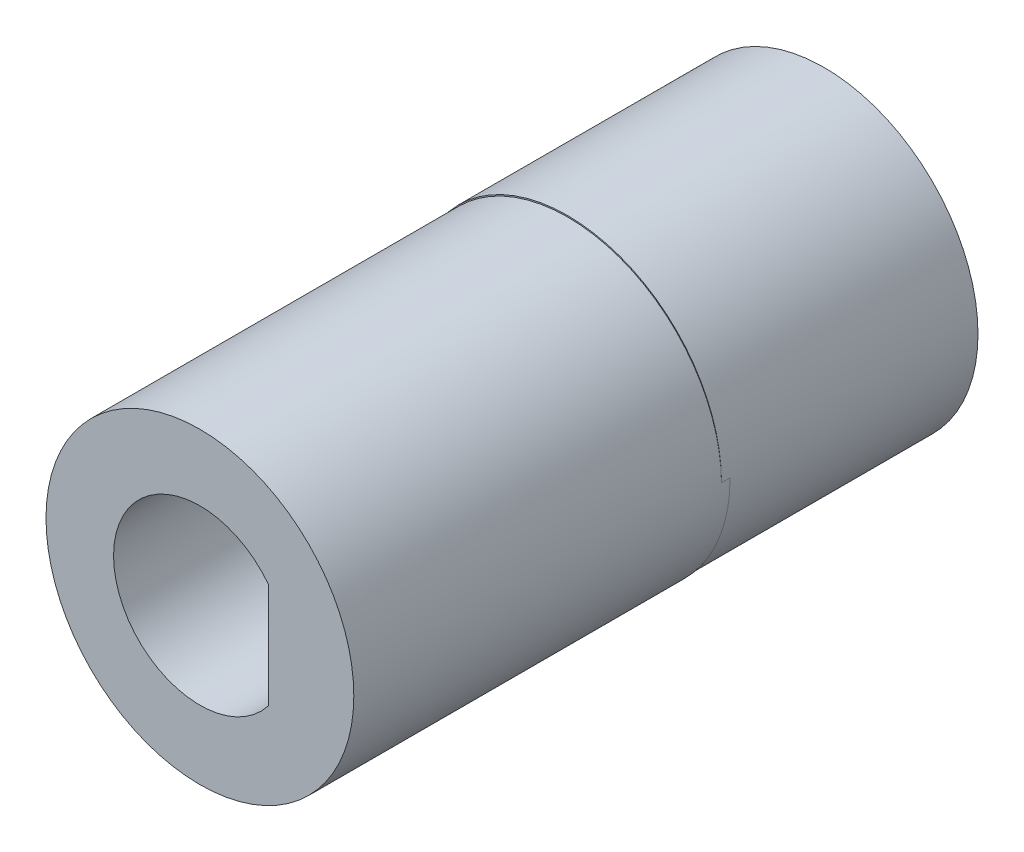
ISO-10303-21;
HEADER;
FILE_DESCRIPTION(('STEP AP214'),'2;1');
FILE_NAME('part.step','',(''),(''),'','','');
FILE_SCHEMA(('AUTOMOTIVE_DESIGN { 1 0 10303 214 1 1 1 1 }'));
ENDSEC;
DATA;
#1=APPLICATION_CONTEXT('core data for automotive mechanical design processes');
#2=APPLICATION_PROTOCOL_DEFINITION('international standard','automotive_design',2000,#1);
#3=PRODUCT_CONTEXT('',#1,'mechanical');
#4=PRODUCT('Part','Part','',(#3));
#5=PRODUCT_RELATED_PRODUCT_CATEGORY('part','',(#4));
#6=PRODUCT_DEFINITION_FORMATION('','',#4);
#7=PRODUCT_DEFINITION_CONTEXT('part definition',#1,'design');
#8=PRODUCT_DEFINITION('design','',#6,#7);
#9=PRODUCT_DEFINITION_SHAPE('','',#8);
#10=(LENGTH_UNIT() NAMED_UNIT(*) SI_UNIT(.MILLI.,.METRE.));
#11=(NAMED_UNIT(*) PLANE_ANGLE_UNIT() SI_UNIT($,.RADIAN.));
#12=(NAMED_UNIT(*) SI_UNIT($,.STERADIAN.) SOLID_ANGLE_UNIT());
#13=UNCERTAINTY_MEASURE_WITH_UNIT(LENGTH_MEASURE(1.E-05),#10,'distance_accuracy_value','');
#14=(GEOMETRIC_REPRESENTATION_CONTEXT(3) GLOBAL_UNCERTAINTY_ASSIGNED_CONTEXT((#13)) GLOBAL_UNIT_ASSIGNED_CONTEXT((#10,
#11,#12)) REPRESENTATION_CONTEXT('',''));
#15=CARTESIAN_POINT('',(0.,0.,0.));
#16=DIRECTION('',(0.,0.,1.));
#17=DIRECTION('',(1.,0.,0.));
#18=AXIS2_PLACEMENT_3D('',#15,#16,#17);
#19=CARTESIAN_POINT('',(0.,0.,-8.));
#20=DIRECTION('',(0.,0.,1.));
#21=DIRECTION('',(1.,0.,0.));
#22=AXIS2_PLACEMENT_3D('',#19,#20,#21);
#23=CYLINDRICAL_SURFACE('',#22,9.);
#24=CARTESIAN_POINT('',(0.,0.,-8.));
#25=DIRECTION('',(0.,0.,1.));
#26=DIRECTION('',(1.,0.,0.));
#27=AXIS2_PLACEMENT_3D('',#24,#25,#26);
#28=CIRCLE('',#27,9.);
#29=CARTESIAN_POINT('',(9.,0.,-8.));
#30=VERTEX_POINT('',#29);
#31=EDGE_CURVE('E235',#30,#30,#28,.T.);
#32=ORIENTED_EDGE('',*,*,#31,.T.);
#33=EDGE_LOOP('',(#32));
#34=FACE_BOUND('',#33,.T.);
#35=CARTESIAN_POINT('',(0.,0.,7.));
#36=DIRECTION('',(0.,0.,1.));
#37=DIRECTION('',(1.,0.,0.));
#38=AXIS2_PLACEMENT_3D('',#35,#36,#37);
#39=CIRCLE('',#38,9.);
#40=CARTESIAN_POINT('',(8.99992217133125,-0.0374287320141755,7.));
#41=VERTEX_POINT('',#40);
#42=CARTESIAN_POINT('',(-8.99992217133125,-0.0374287320141784,7.));
#43=VERTEX_POINT('',#42);
#44=EDGE_CURVE('E226',#41,#43,#39,.T.);
#45=ORIENTED_EDGE('',*,*,#44,.F.);
#46=DIRECTION('',(0.,0.,1.));
#47=VECTOR('',#46,1.);
#48=CARTESIAN_POINT('',(8.99992217133125,-0.0374287320141764,11.5000000000001));
#49=LINE('',#48,#47);
#50=CARTESIAN_POINT('',(8.99992217133125,-0.0374287320141754,6.50000000000007));
#51=VERTEX_POINT('',#50);
#52=EDGE_CURVE('E83',#41,#51,#49,.F.);
#53=ORIENTED_EDGE('',*,*,#52,.T.);
#54=CARTESIAN_POINT('',(0.,0.,6.50000000000007));
#55=DIRECTION('',(0.,0.,-1.));
#56=DIRECTION('',(0.,1.,0.));
#57=AXIS2_PLACEMENT_3D('',#54,#55,#56);
#58=CIRCLE('',#57,9.);
#59=CARTESIAN_POINT('',(-8.99992217133125,-0.0374287320141784,6.50000000000007));
#60=VERTEX_POINT('',#59);
#61=EDGE_CURVE('E12',#60,#51,#58,.F.);
#62=ORIENTED_EDGE('',*,*,#61,.F.);
#63=DIRECTION('',(0.,0.,1.));
#64=VECTOR('',#63,1.);
#65=CARTESIAN_POINT('',(-8.99992217133125,-0.037428732014178,11.5000000000001));
#66=LINE('',#65,#64);
#67=EDGE_CURVE('E199',#60,#43,#66,.T.);
#68=ORIENTED_EDGE('',*,*,#67,.T.);
#69=EDGE_LOOP('',(#45,#53,#62,#68));
#70=FACE_BOUND('',#69,.T.);
#71=ADVANCED_FACE('F60',(#34,#70),#23,.T.);
#72=CARTESIAN_POINT('',(0.,0.,7.));
#73=DIRECTION('',(0.,0.,1.));
#74=DIRECTION('',(1.,0.,0.));
#75=AXIS2_PLACEMENT_3D('',#72,#73,#74);
#76=PLANE('',#75);
#77=DIRECTION('',(0.,-1.00000000000001,0.));
#78=VECTOR('',#77,1.);
#79=CARTESIAN_POINT('',(2.49999999999306,0.,7.));
#80=LINE('',#79,#78);
#81=CARTESIAN_POINT('',(2.49999999999682,1.74714052097017,7.));
#82=VERTEX_POINT('',#81);
#83=CARTESIAN_POINT('',(2.49999999999773,-1.74714052095881,7.));
#84=VERTEX_POINT('',#83);
#85=EDGE_CURVE('E208',#82,#84,#80,.T.);
#86=ORIENTED_EDGE('',*,*,#85,.T.);
#87=CARTESIAN_POINT('',(0.,0.,7.));
#88=DIRECTION('',(0.,0.,1.));
#89=DIRECTION('',(1.00000000000001,0.,0.));
#90=AXIS2_PLACEMENT_3D('',#87,#88,#89);
#91=CIRCLE('',#90,3.05);
#92=EDGE_CURVE('E212',#82,#84,#91,.T.);
#93=ORIENTED_EDGE('',*,*,#92,.F.);
#94=EDGE_LOOP('',(#86,#93));
#95=FACE_BOUND('',#94,.T.);
#96=CARTESIAN_POINT('',(1.90958480825063E-11,6.67297166736234E-13,7.));
#97=DIRECTION('',(0.,0.,1.));
#98=DIRECTION('',(1.,0.,0.));
#99=AXIS2_PLACEMENT_3D('',#96,#97,#98);
#100=CIRCLE('',#99,5.05);
#101=CARTESIAN_POINT('',(5.0500000000191,6.67297166736234E-13,7.));
#102=VERTEX_POINT('',#101);
#103=EDGE_CURVE('E68',#102,#102,#100,.F.);
#104=ORIENTED_EDGE('',*,*,#103,.F.);
#105=EDGE_LOOP('',(#104));
#106=FACE_BOUND('',#105,.T.);
#107=ADVANCED_FACE('F249',(#95,#106),#76,.T.);
#108=CARTESIAN_POINT('',(0.,0.,-8.));
#109=DIRECTION('',(0.,0.,1.));
#110=DIRECTION('',(1.,0.,0.));
#111=AXIS2_PLACEMENT_3D('',#108,#109,#110);
#112=PLANE('',#111);
#113=CARTESIAN_POINT('',(0.,0.,-8.));
#114=DIRECTION('',(0.,0.,1.));
#115=DIRECTION('',(1.,0.,0.));
#116=AXIS2_PLACEMENT_3D('',#113,#114,#115);
#117=CIRCLE('',#116,3.05);
#118=CARTESIAN_POINT('',(3.05,0.,-8.));
#119=VERTEX_POINT('',#118);
#120=EDGE_CURVE('E231',#119,#119,#117,.T.);
#121=ORIENTED_EDGE('',*,*,#120,.T.);
#122=EDGE_LOOP('',(#121));
#123=FACE_BOUND('',#122,.T.);
#124=ORIENTED_EDGE('',*,*,#31,.F.);
#125=EDGE_LOOP('',(#124));
#126=FACE_BOUND('',#125,.T.);
#127=ADVANCED_FACE('F251',(#123,#126),#112,.F.);
#128=CARTESIAN_POINT('',(0.,0.,-8.));
#129=DIRECTION('',(0.,0.,1.));
#130=DIRECTION('',(1.,0.,0.));
#131=AXIS2_PLACEMENT_3D('',#128,#129,#130);
#132=CYLINDRICAL_SURFACE('',#131,3.05);
#133=ORIENTED_EDGE('',*,*,#120,.F.);
#134=EDGE_LOOP('',(#133));
#135=FACE_BOUND('',#134,.T.);
#136=CARTESIAN_POINT('',(0.,0.,0.));
#137=DIRECTION('',(0.,0.,1.));
#138=DIRECTION('',(1.,0.,0.));
#139=AXIS2_PLACEMENT_3D('',#136,#137,#138);
#140=CIRCLE('',#139,3.05);
#141=CARTESIAN_POINT('',(2.50000000000245,-1.74714052096211,0.));
#142=VERTEX_POINT('',#141);
#143=CARTESIAN_POINT('',(2.4999999999931,1.74714052097553,0.));
#144=VERTEX_POINT('',#143);
#145=EDGE_CURVE('E230',#142,#144,#140,.T.);
#146=ORIENTED_EDGE('',*,*,#145,.T.);
#147=DIRECTION('',(0.,0.,-1.));
#148=VECTOR('',#147,1.);
#149=CARTESIAN_POINT('',(2.49999999999995,1.74714052097236,7.));
#150=LINE('',#149,#148);
#151=EDGE_CURVE('E222',#82,#144,#150,.T.);
#152=ORIENTED_EDGE('',*,*,#151,.F.);
#153=ORIENTED_EDGE('',*,*,#92,.T.);
#154=DIRECTION('',(0.,0.,-1.));
#155=VECTOR('',#154,1.);
#156=CARTESIAN_POINT('',(2.49999999999773,-1.74714052095881,7.));
#157=LINE('',#156,#155);
#158=EDGE_CURVE('E215',#84,#142,#157,.T.);
#159=ORIENTED_EDGE('',*,*,#158,.T.);
#160=EDGE_LOOP('',(#146,#152,#153,#159));
#161=FACE_BOUND('',#160,.T.);
#162=ADVANCED_FACE('F260',(#135,#161),#132,.F.);
#163=ORIENTED_EDGE('',*,*,#44,.T.);
#164=CARTESIAN_POINT('',(0.,-0.0748574640283539,7.));
#165=DIRECTION('',(0.,0.,1.));
#166=DIRECTION('',(1.,0.,0.));
#167=AXIS2_PLACEMENT_3D('',#164,#165,#166);
#168=CIRCLE('',#167,9.);
#169=EDGE_CURVE('E242',#43,#41,#168,.F.);
#170=ORIENTED_EDGE('',*,*,#169,.T.);
#171=EDGE_LOOP('',(#163,#170));
#172=FACE_BOUND('',#171,.T.);
#173=ADVANCED_FACE('F254',(#172),#76,.T.);
#174=CARTESIAN_POINT('',(0.,0.,0.));
#175=DIRECTION('',(0.,0.,1.));
#176=DIRECTION('',(1.,0.,0.));
#177=AXIS2_PLACEMENT_3D('',#174,#175,#176);
#178=PLANE('',#177);
#179=ORIENTED_EDGE('',*,*,#145,.F.);
#180=DIRECTION('',(0.,-1.00000000000001,0.));
#181=VECTOR('',#180,1.);
#182=CARTESIAN_POINT('',(2.49999999999306,0.,0.));
#183=LINE('',#182,#181);
#184=EDGE_CURVE('E207',#144,#142,#183,.T.);
#185=ORIENTED_EDGE('',*,*,#184,.F.);
#186=EDGE_LOOP('',(#179,#185));
#187=FACE_BOUND('',#186,.T.);
#188=ADVANCED_FACE('F265',(#187),#178,.F.);
#189=CARTESIAN_POINT('',(2.49999999999306,0.,7.));
#190=DIRECTION('',(1.,0.,0.));
#191=DIRECTION('',(0.,1.,0.));
#192=AXIS2_PLACEMENT_3D('',#189,#190,#191);
#193=PLANE('',#192);
#194=ORIENTED_EDGE('',*,*,#184,.T.);
#195=ORIENTED_EDGE('',*,*,#158,.F.);
#196=ORIENTED_EDGE('',*,*,#85,.F.);
#197=ORIENTED_EDGE('',*,*,#151,.T.);
#198=EDGE_LOOP('',(#194,#195,#196,#197));
#199=FACE_BOUND('',#198,.T.);
#200=ADVANCED_FACE('F271',(#199),#193,.F.);
#201=CARTESIAN_POINT('',(1.90958487171881E-11,6.67358395786821E-13,6.50000000000007));
#202=DIRECTION('',(0.,0.,1.));
#203=DIRECTION('',(0.,-1.,0.));
#204=AXIS2_PLACEMENT_3D('',#201,#202,#203);
#205=CYLINDRICAL_SURFACE('',#204,5.05);
#206=ORIENTED_EDGE('',*,*,#103,.T.);
#207=EDGE_LOOP('',(#206));
#208=FACE_BOUND('',#207,.T.);
#209=CARTESIAN_POINT('',(1.90958360235527E-11,6.66133814775094E-13,16.5000000000001));
#210=DIRECTION('',(0.,0.,-1.));
#211=DIRECTION('',(0.,1.,0.));
#212=AXIS2_PLACEMENT_3D('',#209,#210,#211);
#213=CIRCLE('',#212,5.05);
#214=CARTESIAN_POINT('',(4.00006136280768,3.08253290231264,16.5000000000001));
#215=VERTEX_POINT('',#214);
#216=CARTESIAN_POINT('',(4.00006136282433,-3.08253290230449,16.5000000000001));
#217=VERTEX_POINT('',#216);
#218=EDGE_CURVE('E75',#215,#217,#213,.T.);
#219=ORIENTED_EDGE('',*,*,#218,.F.);
#220=DIRECTION('',(0.,0.,-1.));
#221=VECTOR('',#220,1.);
#222=CARTESIAN_POINT('',(4.00006136280768,3.08253290231264,28.5000000000001));
#223=LINE('',#222,#221);
#224=CARTESIAN_POINT('',(4.00006136280768,3.08253290231264,28.5000000000001));
#225=VERTEX_POINT('',#224);
#226=EDGE_CURVE('E147',#225,#215,#223,.T.);
#227=ORIENTED_EDGE('',*,*,#226,.F.);
#228=CARTESIAN_POINT('',(1.90958207911902E-11,6.64664317561022E-13,28.5000000000001));
#229=DIRECTION('',(0.,0.,-1.));
#230=DIRECTION('',(0.,1.,0.));
#231=AXIS2_PLACEMENT_3D('',#228,#229,#230);
#232=CIRCLE('',#231,5.05);
#233=CARTESIAN_POINT('',(4.00006136281021,-3.08253290230282,28.5000000000001));
#234=VERTEX_POINT('',#233);
#235=EDGE_CURVE('E144',#234,#225,#232,.T.);
#236=ORIENTED_EDGE('',*,*,#235,.F.);
#237=DIRECTION('',(0.,0.,-1.));
#238=VECTOR('',#237,1.);
#239=CARTESIAN_POINT('',(4.00006136281021,-3.08253290230282,28.5000000000001));
#240=LINE('',#239,#238);
#241=EDGE_CURVE('E132',#234,#217,#240,.T.);
#242=ORIENTED_EDGE('',*,*,#241,.T.);
#243=EDGE_LOOP('',(#219,#227,#236,#242));
#244=FACE_BOUND('',#243,.T.);
#245=ADVANCED_FACE('F145',(#208,#244),#205,.F.);
#246=CARTESIAN_POINT('',(0.,-0.0748574640283538,6.50000000000007));
#247=DIRECTION('',(0.,0.,1.));
#248=DIRECTION('',(0.,-1.,0.));
#249=AXIS2_PLACEMENT_3D('',#246,#247,#248);
#250=CYLINDRICAL_SURFACE('',#249,9.);
#251=ORIENTED_EDGE('',*,*,#52,.F.);
#252=ORIENTED_EDGE('',*,*,#169,.F.);
#253=ORIENTED_EDGE('',*,*,#67,.F.);
#254=CARTESIAN_POINT('',(0.,-0.0748574640283538,6.50000000000007));
#255=DIRECTION('',(0.,0.,-1.));
#256=DIRECTION('',(0.,1.,0.));
#257=AXIS2_PLACEMENT_3D('',#254,#255,#256);
#258=CIRCLE('',#257,9.);
#259=EDGE_CURVE('E195',#51,#60,#258,.T.);
#260=ORIENTED_EDGE('',*,*,#259,.F.);
#261=EDGE_LOOP('',(#251,#252,#253,#260));
#262=FACE_BOUND('',#261,.T.);
#263=CARTESIAN_POINT('',(0.,-0.0748574640283565,28.5000000000001));
#264=DIRECTION('',(0.,0.,-1.));
#265=DIRECTION('',(0.,1.,0.));
#266=AXIS2_PLACEMENT_3D('',#263,#264,#265);
#267=CIRCLE('',#266,9.);
#268=CARTESIAN_POINT('',(0.,8.92514253597164,28.5000000000001));
#269=VERTEX_POINT('',#268);
#270=EDGE_CURVE('E141',#269,#269,#267,.T.);
#271=ORIENTED_EDGE('',*,*,#270,.T.);
#272=EDGE_LOOP('',(#271));
#273=FACE_BOUND('',#272,.T.);
#274=ADVANCED_FACE('F279',(#262,#273),#250,.T.);
#275=CARTESIAN_POINT('',(0.,0.,6.50000000000007));
#276=DIRECTION('',(0.,0.,-1.));
#277=DIRECTION('',(0.,1.,0.));
#278=AXIS2_PLACEMENT_3D('',#275,#276,#277);
#279=PLANE('',#278);
#280=ORIENTED_EDGE('',*,*,#259,.T.);
#281=ORIENTED_EDGE('',*,*,#61,.T.);
#282=EDGE_LOOP('',(#280,#281));
#283=FACE_BOUND('',#282,.T.);
#284=ADVANCED_FACE('F282',(#283),#279,.T.);
#285=CARTESIAN_POINT('',(4.00006136282416,2.1980946390364E-11,28.5000000000001));
#286=DIRECTION('',(-1.,0.,0.));
#287=DIRECTION('',(0.,-1.,0.));
#288=AXIS2_PLACEMENT_3D('',#285,#286,#287);
#289=PLANE('',#288);
#290=DIRECTION('',(0.,1.00000000000002,0.));
#291=VECTOR('',#290,1.);
#292=CARTESIAN_POINT('',(4.00006136282416,2.19824158875781E-11,16.5000000000001));
#293=LINE('',#292,#291);
#294=CARTESIAN_POINT('',(4.00006136281639,2.99991818120504,16.5000000000001));
#295=VERTEX_POINT('',#294);
#296=EDGE_CURVE('E152',#295,#215,#293,.T.);
#297=ORIENTED_EDGE('',*,*,#296,.F.);
#298=DIRECTION('',(0.,0.,-1.));
#299=VECTOR('',#298,1.);
#300=CARTESIAN_POINT('',(4.00006136281639,2.99991818120504,28.5000000000001));
#301=LINE('',#300,#299);
#302=CARTESIAN_POINT('',(4.00006136281639,2.99991818120504,28.5000000000001));
#303=VERTEX_POINT('',#302);
#304=EDGE_CURVE('E186',#303,#295,#301,.T.);
#305=ORIENTED_EDGE('',*,*,#304,.F.);
#306=DIRECTION('',(0.,1.00000000000002,0.));
#307=VECTOR('',#306,1.);
#308=CARTESIAN_POINT('',(4.00006136282416,2.1980946390364E-11,28.5000000000001));
#309=LINE('',#308,#307);
#310=EDGE_CURVE('E161',#303,#225,#309,.T.);
#311=ORIENTED_EDGE('',*,*,#310,.T.);
#312=ORIENTED_EDGE('',*,*,#226,.T.);
#313=EDGE_LOOP('',(#297,#305,#311,#312));
#314=FACE_BOUND('',#313,.T.);
#315=ADVANCED_FACE('F284',(#314),#289,.T.);
#316=CARTESIAN_POINT('',(1.90958207911902E-11,6.64664317561022E-13,28.5000000000001));
#317=DIRECTION('',(0.,0.,-1.));
#318=DIRECTION('',(0.,1.,0.));
#319=AXIS2_PLACEMENT_3D('',#316,#317,#318);
#320=CYLINDRICAL_SURFACE('',#319,5.);
#321=CARTESIAN_POINT('',(1.90958360235527E-11,6.66133814775094E-13,16.5000000000001));
#322=DIRECTION('',(0.,0.,-1.));
#323=DIRECTION('',(0.,1.00000000000002,0.));
#324=AXIS2_PLACEMENT_3D('',#321,#322,#323);
#325=CIRCLE('',#324,5.);
#326=CARTESIAN_POINT('',(4.01654773184212,2.97780864359232,16.5000000000001));
#327=VERTEX_POINT('',#326);
#328=EDGE_CURVE('E181',#295,#327,#325,.T.);
#329=ORIENTED_EDGE('',*,*,#328,.T.);
#330=DIRECTION('',(0.,0.,-1.));
#331=VECTOR('',#330,1.);
#332=CARTESIAN_POINT('',(4.01654773184212,2.97780864359232,28.5000000000001));
#333=LINE('',#332,#331);
#334=CARTESIAN_POINT('',(4.01654773184212,2.97780864359232,28.5000000000001));
#335=VERTEX_POINT('',#334);
#336=EDGE_CURVE('E189',#335,#327,#333,.T.);
#337=ORIENTED_EDGE('',*,*,#336,.F.);
#338=CARTESIAN_POINT('',(1.90958207911902E-11,6.64664317561022E-13,28.5000000000001));
#339=DIRECTION('',(0.,0.,-1.));
#340=DIRECTION('',(0.,1.00000000000002,0.));
#341=AXIS2_PLACEMENT_3D('',#338,#339,#340);
#342=CIRCLE('',#341,5.);
#343=EDGE_CURVE('E163',#303,#335,#342,.T.);
#344=ORIENTED_EDGE('',*,*,#343,.F.);
#345=ORIENTED_EDGE('',*,*,#304,.T.);
#346=EDGE_LOOP('',(#329,#337,#344,#345));
#347=FACE_BOUND('',#346,.T.);
#348=ADVANCED_FACE('F290',(#347),#320,.F.);
#349=CARTESIAN_POINT('',(3.99993875736437,-0.0221453002478015,28.5000000000001));
#350=DIRECTION('',(0.999984674435425,-0.00553632497939614,0.));
#351=DIRECTION('',(0.00553632497939614,0.999984674435425,0.));
#352=AXIS2_PLACEMENT_3D('',#349,#350,#351);
#353=PLANE('',#352);
#354=DIRECTION('',(-0.00553632497939632,-0.999984674435458,0.));
#355=VECTOR('',#354,1.);
#356=CARTESIAN_POINT('',(3.99993875736437,-0.0221453002478,16.5000000000001));
#357=LINE('',#356,#355);
#358=CARTESIAN_POINT('',(4.00006136282416,2.24265050974282E-11,16.5000000000001));
#359=VERTEX_POINT('',#358);
#360=EDGE_CURVE('E177',#327,#359,#357,.T.);
#361=ORIENTED_EDGE('',*,*,#360,.T.);
#362=DIRECTION('',(0.,0.,-1.));
#363=VECTOR('',#362,1.);
#364=CARTESIAN_POINT('',(4.00006136282416,2.24250356002141E-11,28.5000000000001));
#365=LINE('',#364,#363);
#366=CARTESIAN_POINT('',(4.00006136282416,2.24250356002141E-11,28.5000000000001));
#367=VERTEX_POINT('',#366);
#368=EDGE_CURVE('E140',#367,#359,#365,.T.);
#369=ORIENTED_EDGE('',*,*,#368,.F.);
#370=DIRECTION('',(-0.00553632497939632,-0.999984674435458,0.));
#371=VECTOR('',#370,1.);
#372=CARTESIAN_POINT('',(3.99993875736437,-0.0221453002478015,28.5000000000001));
#373=LINE('',#372,#371);
#374=EDGE_CURVE('E157',#335,#367,#373,.T.);
#375=ORIENTED_EDGE('',*,*,#374,.F.);
#376=ORIENTED_EDGE('',*,*,#336,.T.);
#377=EDGE_LOOP('',(#361,#369,#375,#376));
#378=FACE_BOUND('',#377,.T.);
#379=ADVANCED_FACE('F294',(#378),#353,.F.);
#380=EDGE_CURVE('E137',#217,#359,#293,.T.);
#381=ORIENTED_EDGE('',*,*,#380,.F.);
#382=ORIENTED_EDGE('',*,*,#241,.F.);
#383=EDGE_CURVE('E136',#234,#367,#309,.T.);
#384=ORIENTED_EDGE('',*,*,#383,.T.);
#385=ORIENTED_EDGE('',*,*,#368,.T.);
#386=EDGE_LOOP('',(#381,#382,#384,#385));
#387=FACE_BOUND('',#386,.T.);
#388=ADVANCED_FACE('F134',(#387),#289,.T.);
#389=CARTESIAN_POINT('',(0.,0.,28.5000000000001));
#390=DIRECTION('',(0.,0.,-1.));
#391=DIRECTION('',(0.,1.,0.));
#392=AXIS2_PLACEMENT_3D('',#389,#390,#391);
#393=PLANE('',#392);
#394=ORIENTED_EDGE('',*,*,#235,.T.);
#395=ORIENTED_EDGE('',*,*,#310,.F.);
#396=ORIENTED_EDGE('',*,*,#343,.T.);
#397=ORIENTED_EDGE('',*,*,#374,.T.);
#398=ORIENTED_EDGE('',*,*,#383,.F.);
#399=EDGE_LOOP('',(#394,#395,#396,#397,#398));
#400=FACE_BOUND('',#399,.T.);
#401=ORIENTED_EDGE('',*,*,#270,.F.);
#402=EDGE_LOOP('',(#401));
#403=FACE_BOUND('',#402,.T.);
#404=ADVANCED_FACE('F154',(#400,#403),#393,.F.);
#405=CARTESIAN_POINT('',(0.,0.,16.5000000000001));
#406=DIRECTION('',(0.,0.,-1.));
#407=DIRECTION('',(0.,1.,0.));
#408=AXIS2_PLACEMENT_3D('',#405,#406,#407);
#409=PLANE('',#408);
#410=ORIENTED_EDGE('',*,*,#296,.T.);
#411=ORIENTED_EDGE('',*,*,#218,.T.);
#412=ORIENTED_EDGE('',*,*,#380,.T.);
#413=ORIENTED_EDGE('',*,*,#360,.F.);
#414=ORIENTED_EDGE('',*,*,#328,.F.);
#415=EDGE_LOOP('',(#410,#411,#412,#413,#414));
#416=FACE_BOUND('',#415,.T.);
#417=ADVANCED_FACE('F353',(#416),#409,.T.);
#418=CLOSED_SHELL('',(#71,#107,#127,#162,#173,#188,#200,#245,#274,#284,#315,#348,#379,#388,#404,#417));
#419=MANIFOLD_SOLID_BREP('B2',#418);
#420=ADVANCED_BREP_SHAPE_REPRESENTATION('',(#18,#419),#14);
#421=SHAPE_DEFINITION_REPRESENTATION(#9,#420);
ENDSEC;
END-ISO-10303-21;
